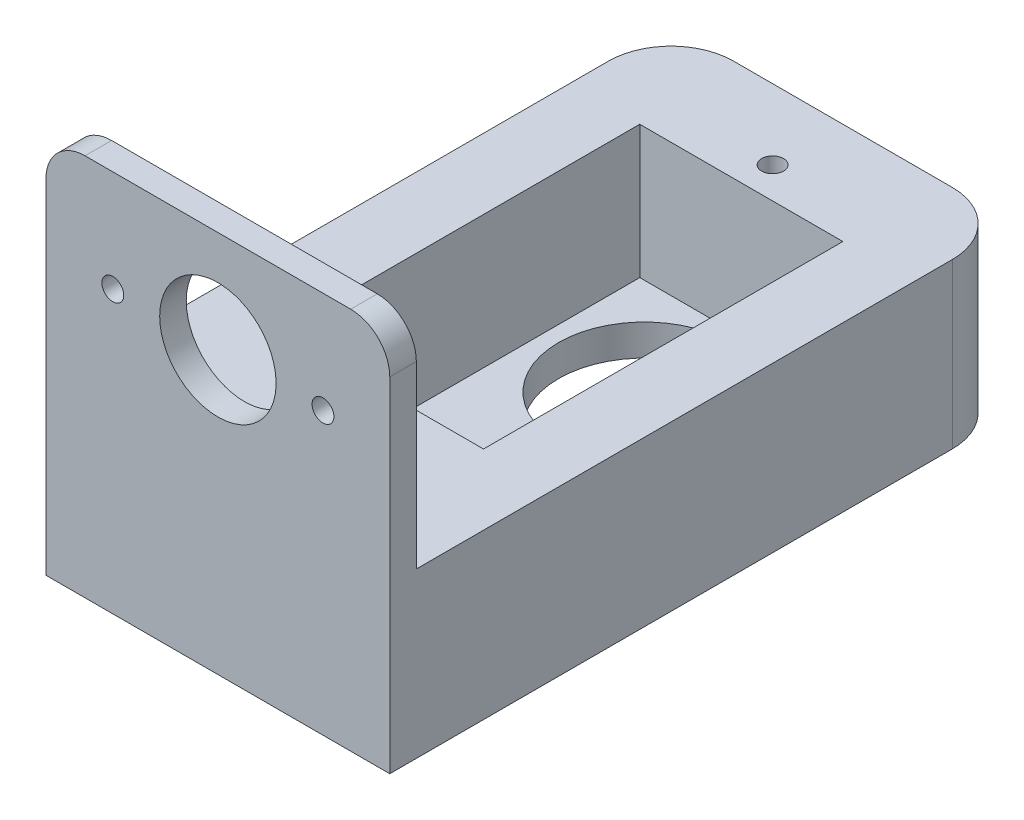
ISO-10303-21;
HEADER;
FILE_DESCRIPTION(('STEP AP214'),'2;1');
FILE_NAME('part.step','',(''),(''),'','','');
FILE_SCHEMA(('AUTOMOTIVE_DESIGN { 1 0 10303 214 1 1 1 1 }'));
ENDSEC;
DATA;
#1=APPLICATION_CONTEXT('core data for automotive mechanical design processes');
#2=APPLICATION_PROTOCOL_DEFINITION('international standard','automotive_design',2000,#1);
#3=PRODUCT_CONTEXT('',#1,'mechanical');
#4=PRODUCT('Part','Part','',(#3));
#5=PRODUCT_RELATED_PRODUCT_CATEGORY('part','',(#4));
#6=PRODUCT_DEFINITION_FORMATION('','',#4);
#7=PRODUCT_DEFINITION_CONTEXT('part definition',#1,'design');
#8=PRODUCT_DEFINITION('design','',#6,#7);
#9=PRODUCT_DEFINITION_SHAPE('','',#8);
#10=(LENGTH_UNIT() NAMED_UNIT(*) SI_UNIT(.MILLI.,.METRE.));
#11=(NAMED_UNIT(*) PLANE_ANGLE_UNIT() SI_UNIT($,.RADIAN.));
#12=(NAMED_UNIT(*) SI_UNIT($,.STERADIAN.) SOLID_ANGLE_UNIT());
#13=UNCERTAINTY_MEASURE_WITH_UNIT(LENGTH_MEASURE(1.E-05),#10,'distance_accuracy_value','');
#14=(GEOMETRIC_REPRESENTATION_CONTEXT(3) GLOBAL_UNCERTAINTY_ASSIGNED_CONTEXT((#13)) GLOBAL_UNIT_ASSIGNED_CONTEXT((#10,
#11,#12)) REPRESENTATION_CONTEXT('',''));
#15=CARTESIAN_POINT('',(0.,0.,0.));
#16=DIRECTION('',(0.,0.,1.));
#17=DIRECTION('',(1.,0.,0.));
#18=AXIS2_PLACEMENT_3D('',#15,#16,#17);
#19=CARTESIAN_POINT('',(0.,10.5,0.));
#20=DIRECTION('',(0.,0.,-1.));
#21=DIRECTION('',(-1.,0.,0.));
#22=AXIS2_PLACEMENT_3D('',#19,#20,#21);
#23=PLANE('',#22);
#24=CARTESIAN_POINT('',(4.275,18.,0.));
#25=DIRECTION('',(0.,0.,-1.));
#26=DIRECTION('',(-1.,0.,0.));
#27=AXIS2_PLACEMENT_3D('',#24,#25,#26);
#28=CIRCLE('',#27,0.7);
#29=CARTESIAN_POINT('',(3.575,18.,0.));
#30=VERTEX_POINT('',#29);
#31=EDGE_CURVE('E392',#30,#30,#28,.T.);
#32=ORIENTED_EDGE('',*,*,#31,.T.);
#33=EDGE_LOOP('',(#32));
#34=FACE_BOUND('',#33,.T.);
#35=CARTESIAN_POINT('',(17.725,18.,0.));
#36=DIRECTION('',(0.,0.,-1.));
#37=DIRECTION('',(-1.,0.,0.));
#38=AXIS2_PLACEMENT_3D('',#35,#36,#37);
#39=CIRCLE('',#38,0.699999999999998);
#40=CARTESIAN_POINT('',(17.025,18.,0.));
#41=VERTEX_POINT('',#40);
#42=EDGE_CURVE('E387',#41,#41,#39,.T.);
#43=ORIENTED_EDGE('',*,*,#42,.T.);
#44=EDGE_LOOP('',(#43));
#45=FACE_BOUND('',#44,.T.);
#46=CARTESIAN_POINT('',(11.,18.,0.));
#47=DIRECTION('',(0.,0.,-1.));
#48=DIRECTION('',(-1.,0.,0.));
#49=AXIS2_PLACEMENT_3D('',#46,#47,#48);
#50=CIRCLE('',#49,3.725);
#51=CARTESIAN_POINT('',(7.275,18.,0.));
#52=VERTEX_POINT('',#51);
#53=EDGE_CURVE('E158',#52,#52,#50,.T.);
#54=ORIENTED_EDGE('',*,*,#53,.T.);
#55=EDGE_LOOP('',(#54));
#56=FACE_BOUND('',#55,.T.);
#57=DIRECTION('',(1.,0.,0.));
#58=VECTOR('',#57,1.);
#59=CARTESIAN_POINT('',(0.,24.5,0.));
#60=LINE('',#59,#58);
#61=CARTESIAN_POINT('',(2.5,24.5,0.));
#62=VERTEX_POINT('',#61);
#63=CARTESIAN_POINT('',(19.5,24.5,0.));
#64=VERTEX_POINT('',#63);
#65=EDGE_CURVE('E157',#62,#64,#60,.T.);
#66=ORIENTED_EDGE('',*,*,#65,.F.);
#67=CARTESIAN_POINT('',(2.5,22.,0.));
#68=DIRECTION('',(0.,0.,-1.));
#69=DIRECTION('',(-1.,0.,0.));
#70=AXIS2_PLACEMENT_3D('',#67,#68,#69);
#71=CIRCLE('',#70,2.5);
#72=CARTESIAN_POINT('',(0.,22.,0.));
#73=VERTEX_POINT('',#72);
#74=EDGE_CURVE('E249',#62,#73,#71,.F.);
#75=ORIENTED_EDGE('',*,*,#74,.T.);
#76=DIRECTION('',(0.,-1.,0.));
#77=VECTOR('',#76,1.);
#78=CARTESIAN_POINT('',(0.,10.5,0.));
#79=LINE('',#78,#77);
#80=CARTESIAN_POINT('',(0.,0.,0.));
#81=VERTEX_POINT('',#80);
#82=EDGE_CURVE('E153',#73,#81,#79,.T.);
#83=ORIENTED_EDGE('',*,*,#82,.T.);
#84=DIRECTION('',(1.,0.,0.));
#85=VECTOR('',#84,1.);
#86=CARTESIAN_POINT('',(0.,0.,0.));
#87=LINE('',#86,#85);
#88=CARTESIAN_POINT('',(22.,0.,0.));
#89=VERTEX_POINT('',#88);
#90=EDGE_CURVE('E200',#81,#89,#87,.T.);
#91=ORIENTED_EDGE('',*,*,#90,.T.);
#92=DIRECTION('',(0.,-1.,0.));
#93=VECTOR('',#92,1.);
#94=CARTESIAN_POINT('',(22.,10.5,0.));
#95=LINE('',#94,#93);
#96=CARTESIAN_POINT('',(22.,22.,0.));
#97=VERTEX_POINT('',#96);
#98=EDGE_CURVE('E223',#97,#89,#95,.T.);
#99=ORIENTED_EDGE('',*,*,#98,.F.);
#100=CARTESIAN_POINT('',(19.5,22.,0.));
#101=DIRECTION('',(0.,0.,-1.));
#102=DIRECTION('',(-1.,0.,0.));
#103=AXIS2_PLACEMENT_3D('',#100,#101,#102);
#104=CIRCLE('',#103,2.5);
#105=EDGE_CURVE('E247',#97,#64,#104,.F.);
#106=ORIENTED_EDGE('',*,*,#105,.T.);
#107=EDGE_LOOP('',(#66,#75,#83,#91,#99,#106));
#108=FACE_BOUND('',#107,.T.);
#109=ADVANCED_FACE('F33',(#34,#45,#56,#108),#23,.F.);
#110=CARTESIAN_POINT('',(22.,10.5,0.));
#111=DIRECTION('',(-1.,0.,0.));
#112=DIRECTION('',(0.,0.,1.));
#113=AXIS2_PLACEMENT_3D('',#110,#111,#112);
#114=PLANE('',#113);
#115=DIRECTION('',(0.,-1.,0.));
#116=VECTOR('',#115,1.);
#117=CARTESIAN_POINT('',(22.,24.5,-1.7));
#118=LINE('',#117,#116);
#119=CARTESIAN_POINT('',(22.,22.,-1.7));
#120=VERTEX_POINT('',#119);
#121=CARTESIAN_POINT('',(22.,10.5,-1.7));
#122=VERTEX_POINT('',#121);
#123=EDGE_CURVE('E140',#120,#122,#118,.T.);
#124=ORIENTED_EDGE('',*,*,#123,.F.);
#125=DIRECTION('',(0.,0.,-1.));
#126=VECTOR('',#125,1.);
#127=CARTESIAN_POINT('',(22.,22.,0.));
#128=LINE('',#127,#126);
#129=EDGE_CURVE('E11',#120,#97,#128,.F.);
#130=ORIENTED_EDGE('',*,*,#129,.T.);
#131=ORIENTED_EDGE('',*,*,#98,.T.);
#132=DIRECTION('',(0.,0.,-1.));
#133=VECTOR('',#132,1.);
#134=CARTESIAN_POINT('',(22.,0.,0.));
#135=LINE('',#134,#133);
#136=CARTESIAN_POINT('',(22.,0.,-36.));
#137=VERTEX_POINT('',#136);
#138=EDGE_CURVE('E214',#89,#137,#135,.T.);
#139=ORIENTED_EDGE('',*,*,#138,.T.);
#140=DIRECTION('',(0.,-1.,0.));
#141=VECTOR('',#140,1.);
#142=CARTESIAN_POINT('',(22.,10.5,-36.));
#143=LINE('',#142,#141);
#144=CARTESIAN_POINT('',(22.,10.5,-36.));
#145=VERTEX_POINT('',#144);
#146=EDGE_CURVE('E239',#137,#145,#143,.F.);
#147=ORIENTED_EDGE('',*,*,#146,.T.);
#148=DIRECTION('',(0.,0.,-1.));
#149=VECTOR('',#148,1.);
#150=CARTESIAN_POINT('',(22.,10.5,0.));
#151=LINE('',#150,#149);
#152=EDGE_CURVE('E207',#122,#145,#151,.T.);
#153=ORIENTED_EDGE('',*,*,#152,.F.);
#154=EDGE_LOOP('',(#124,#130,#131,#139,#147,#153));
#155=FACE_BOUND('',#154,.T.);
#156=ADVANCED_FACE('F272',(#155),#114,.F.);
#157=CARTESIAN_POINT('',(0.,10.5,-40.));
#158=DIRECTION('',(0.,0.,-1.));
#159=DIRECTION('',(-1.,0.,0.));
#160=AXIS2_PLACEMENT_3D('',#157,#158,#159);
#161=PLANE('',#160);
#162=DIRECTION('',(1.,0.,0.));
#163=VECTOR('',#162,1.);
#164=CARTESIAN_POINT('',(0.,0.,-40.));
#165=LINE('',#164,#163);
#166=CARTESIAN_POINT('',(3.99999999999999,0.,-40.));
#167=VERTEX_POINT('',#166);
#168=CARTESIAN_POINT('',(18.,0.,-40.));
#169=VERTEX_POINT('',#168);
#170=EDGE_CURVE('E217',#167,#169,#165,.T.);
#171=ORIENTED_EDGE('',*,*,#170,.F.);
#172=DIRECTION('',(0.,-1.,0.));
#173=VECTOR('',#172,1.);
#174=CARTESIAN_POINT('',(3.99999999999999,10.5,-40.));
#175=LINE('',#174,#173);
#176=CARTESIAN_POINT('',(3.99999999999999,10.5,-40.));
#177=VERTEX_POINT('',#176);
#178=EDGE_CURVE('E234',#167,#177,#175,.F.);
#179=ORIENTED_EDGE('',*,*,#178,.T.);
#180=DIRECTION('',(1.,0.,0.));
#181=VECTOR('',#180,1.);
#182=CARTESIAN_POINT('',(0.,10.5,-40.));
#183=LINE('',#182,#181);
#184=CARTESIAN_POINT('',(18.,10.5,-40.));
#185=VERTEX_POINT('',#184);
#186=EDGE_CURVE('E154',#177,#185,#183,.T.);
#187=ORIENTED_EDGE('',*,*,#186,.T.);
#188=DIRECTION('',(0.,-1.,0.));
#189=VECTOR('',#188,1.);
#190=CARTESIAN_POINT('',(18.,0.,-40.));
#191=LINE('',#190,#189);
#192=EDGE_CURVE('E231',#185,#169,#191,.T.);
#193=ORIENTED_EDGE('',*,*,#192,.T.);
#194=EDGE_LOOP('',(#171,#179,#187,#193));
#195=FACE_BOUND('',#194,.T.);
#196=ADVANCED_FACE('F279',(#195),#161,.T.);
#197=CARTESIAN_POINT('',(0.,10.5,0.));
#198=DIRECTION('',(-1.,0.,0.));
#199=DIRECTION('',(0.,0.,1.));
#200=AXIS2_PLACEMENT_3D('',#197,#198,#199);
#201=PLANE('',#200);
#202=ORIENTED_EDGE('',*,*,#82,.F.);
#203=DIRECTION('',(0.,0.,1.));
#204=VECTOR('',#203,1.);
#205=CARTESIAN_POINT('',(0.,22.,0.));
#206=LINE('',#205,#204);
#207=CARTESIAN_POINT('',(0.,22.,-1.7));
#208=VERTEX_POINT('',#207);
#209=EDGE_CURVE('E56',#73,#208,#206,.F.);
#210=ORIENTED_EDGE('',*,*,#209,.T.);
#211=DIRECTION('',(0.,-1.,0.));
#212=VECTOR('',#211,1.);
#213=CARTESIAN_POINT('',(0.,24.5,-1.7));
#214=LINE('',#213,#212);
#215=CARTESIAN_POINT('',(0.,10.5,-1.7));
#216=VERTEX_POINT('',#215);
#217=EDGE_CURVE('E132',#208,#216,#214,.T.);
#218=ORIENTED_EDGE('',*,*,#217,.T.);
#219=DIRECTION('',(0.,0.,-1.));
#220=VECTOR('',#219,1.);
#221=CARTESIAN_POINT('',(0.,10.5,0.));
#222=LINE('',#221,#220);
#223=CARTESIAN_POINT('',(0.,10.5,-36.));
#224=VERTEX_POINT('',#223);
#225=EDGE_CURVE('E136',#216,#224,#222,.T.);
#226=ORIENTED_EDGE('',*,*,#225,.T.);
#227=DIRECTION('',(0.,-1.,0.));
#228=VECTOR('',#227,1.);
#229=CARTESIAN_POINT('',(0.,10.5,-36.));
#230=LINE('',#229,#228);
#231=CARTESIAN_POINT('',(0.,0.,-36.));
#232=VERTEX_POINT('',#231);
#233=EDGE_CURVE('E225',#224,#232,#230,.T.);
#234=ORIENTED_EDGE('',*,*,#233,.T.);
#235=DIRECTION('',(0.,0.,-1.));
#236=VECTOR('',#235,1.);
#237=CARTESIAN_POINT('',(0.,0.,0.));
#238=LINE('',#237,#236);
#239=EDGE_CURVE('E209',#81,#232,#238,.T.);
#240=ORIENTED_EDGE('',*,*,#239,.F.);
#241=EDGE_LOOP('',(#202,#210,#218,#226,#234,#240));
#242=FACE_BOUND('',#241,.T.);
#243=ADVANCED_FACE('F134',(#242),#201,.T.);
#244=CARTESIAN_POINT('',(0.,10.5,0.));
#245=DIRECTION('',(0.,1.,0.));
#246=DIRECTION('',(0.,0.,1.));
#247=AXIS2_PLACEMENT_3D('',#244,#245,#246);
#248=PLANE('',#247);
#249=CARTESIAN_POINT('',(11.,10.5,-35.5));
#250=DIRECTION('',(0.,1.,0.));
#251=DIRECTION('',(0.,0.,1.));
#252=AXIS2_PLACEMENT_3D('',#249,#250,#251);
#253=CIRCLE('',#252,0.699999999999999);
#254=CARTESIAN_POINT('',(11.,10.5,-34.8));
#255=VERTEX_POINT('',#254);
#256=EDGE_CURVE('E373',#255,#255,#253,.T.);
#257=ORIENTED_EDGE('',*,*,#256,.F.);
#258=EDGE_LOOP('',(#257));
#259=FACE_BOUND('',#258,.T.);
#260=CARTESIAN_POINT('',(11.,10.5,-7.5));
#261=DIRECTION('',(0.,1.,0.));
#262=DIRECTION('',(0.,0.,1.));
#263=AXIS2_PLACEMENT_3D('',#260,#261,#262);
#264=CIRCLE('',#263,0.7);
#265=CARTESIAN_POINT('',(11.,10.5,-6.8));
#266=VERTEX_POINT('',#265);
#267=EDGE_CURVE('E379',#266,#266,#264,.T.);
#268=ORIENTED_EDGE('',*,*,#267,.F.);
#269=EDGE_LOOP('',(#268));
#270=FACE_BOUND('',#269,.T.);
#271=ORIENTED_EDGE('',*,*,#186,.F.);
#272=CARTESIAN_POINT('',(3.99999999999999,10.5,-36.));
#273=DIRECTION('',(0.,1.,0.));
#274=DIRECTION('',(0.,0.,1.));
#275=AXIS2_PLACEMENT_3D('',#272,#273,#274);
#276=CIRCLE('',#275,4.);
#277=EDGE_CURVE('E152',#177,#224,#276,.T.);
#278=ORIENTED_EDGE('',*,*,#277,.T.);
#279=ORIENTED_EDGE('',*,*,#225,.F.);
#280=DIRECTION('',(-1.,0.,0.));
#281=VECTOR('',#280,1.);
#282=CARTESIAN_POINT('',(0.,10.5,-1.7));
#283=LINE('',#282,#281);
#284=EDGE_CURVE('E149',#122,#216,#283,.T.);
#285=ORIENTED_EDGE('',*,*,#284,.F.);
#286=ORIENTED_EDGE('',*,*,#152,.T.);
#287=CARTESIAN_POINT('',(18.,10.5,-36.));
#288=DIRECTION('',(0.,1.,0.));
#289=DIRECTION('',(0.,0.,1.));
#290=AXIS2_PLACEMENT_3D('',#287,#288,#289);
#291=CIRCLE('',#290,4.);
#292=EDGE_CURVE('E236',#145,#185,#291,.T.);
#293=ORIENTED_EDGE('',*,*,#292,.T.);
#294=EDGE_LOOP('',(#271,#278,#279,#285,#286,#293));
#295=FACE_BOUND('',#294,.T.);
#296=DIRECTION('',(0.,0.,1.));
#297=VECTOR('',#296,1.);
#298=CARTESIAN_POINT('',(4.5,10.5,-33.5));
#299=LINE('',#298,#297);
#300=CARTESIAN_POINT('',(4.5,10.5,-33.5));
#301=VERTEX_POINT('',#300);
#302=CARTESIAN_POINT('',(4.5,10.5,-10.5));
#303=VERTEX_POINT('',#302);
#304=EDGE_CURVE('E172',#301,#303,#299,.T.);
#305=ORIENTED_EDGE('',*,*,#304,.F.);
#306=DIRECTION('',(-1.,0.,0.));
#307=VECTOR('',#306,1.);
#308=CARTESIAN_POINT('',(4.5,10.5,-33.5));
#309=LINE('',#308,#307);
#310=CARTESIAN_POINT('',(17.5,10.5,-33.5));
#311=VERTEX_POINT('',#310);
#312=EDGE_CURVE('E179',#311,#301,#309,.T.);
#313=ORIENTED_EDGE('',*,*,#312,.F.);
#314=DIRECTION('',(0.,0.,-1.));
#315=VECTOR('',#314,1.);
#316=CARTESIAN_POINT('',(17.5,10.5,-33.5));
#317=LINE('',#316,#315);
#318=CARTESIAN_POINT('',(17.5,10.5,-10.5));
#319=VERTEX_POINT('',#318);
#320=EDGE_CURVE('E193',#319,#311,#317,.T.);
#321=ORIENTED_EDGE('',*,*,#320,.F.);
#322=DIRECTION('',(1.,0.,0.));
#323=VECTOR('',#322,1.);
#324=CARTESIAN_POINT('',(4.5,10.5,-10.5));
#325=LINE('',#324,#323);
#326=EDGE_CURVE('E190',#303,#319,#325,.T.);
#327=ORIENTED_EDGE('',*,*,#326,.F.);
#328=EDGE_LOOP('',(#305,#313,#321,#327));
#329=FACE_BOUND('',#328,.T.);
#330=ADVANCED_FACE('F146',(#259,#270,#295,#329),#248,.T.);
#331=CARTESIAN_POINT('',(0.,0.,0.));
#332=DIRECTION('',(0.,1.,0.));
#333=DIRECTION('',(0.,0.,1.));
#334=AXIS2_PLACEMENT_3D('',#331,#332,#333);
#335=PLANE('',#334);
#336=CARTESIAN_POINT('',(11.,0.,-27.3));
#337=DIRECTION('',(0.,1.,0.));
#338=DIRECTION('',(0.,0.,1.));
#339=AXIS2_PLACEMENT_3D('',#336,#337,#338);
#340=CIRCLE('',#339,5.5);
#341=CARTESIAN_POINT('',(11.,0.,-21.8));
#342=VERTEX_POINT('',#341);
#343=EDGE_CURVE('E169',#342,#342,#340,.T.);
#344=ORIENTED_EDGE('',*,*,#343,.T.);
#345=EDGE_LOOP('',(#344));
#346=FACE_BOUND('',#345,.T.);
#347=ORIENTED_EDGE('',*,*,#239,.T.);
#348=CARTESIAN_POINT('',(3.99999999999999,0.,-36.));
#349=DIRECTION('',(0.,1.,0.));
#350=DIRECTION('',(0.,0.,1.));
#351=AXIS2_PLACEMENT_3D('',#348,#349,#350);
#352=CIRCLE('',#351,4.);
#353=EDGE_CURVE('E229',#232,#167,#352,.F.);
#354=ORIENTED_EDGE('',*,*,#353,.T.);
#355=ORIENTED_EDGE('',*,*,#170,.T.);
#356=CARTESIAN_POINT('',(18.,0.,-36.));
#357=DIRECTION('',(0.,1.,0.));
#358=DIRECTION('',(0.,0.,1.));
#359=AXIS2_PLACEMENT_3D('',#356,#357,#358);
#360=CIRCLE('',#359,4.);
#361=EDGE_CURVE('E227',#169,#137,#360,.F.);
#362=ORIENTED_EDGE('',*,*,#361,.T.);
#363=ORIENTED_EDGE('',*,*,#138,.F.);
#364=ORIENTED_EDGE('',*,*,#90,.F.);
#365=EDGE_LOOP('',(#347,#354,#355,#362,#363,#364));
#366=FACE_BOUND('',#365,.T.);
#367=ADVANCED_FACE('F264',(#346,#366),#335,.F.);
#368=CARTESIAN_POINT('',(4.5,2.,-33.5));
#369=DIRECTION('',(-1.,0.,0.));
#370=DIRECTION('',(0.,0.,1.));
#371=AXIS2_PLACEMENT_3D('',#368,#369,#370);
#372=PLANE('',#371);
#373=ORIENTED_EDGE('',*,*,#304,.T.);
#374=DIRECTION('',(0.,1.,0.));
#375=VECTOR('',#374,1.);
#376=CARTESIAN_POINT('',(4.5,2.,-10.5));
#377=LINE('',#376,#375);
#378=CARTESIAN_POINT('',(4.5,2.,-10.5));
#379=VERTEX_POINT('',#378);
#380=EDGE_CURVE('E188',#379,#303,#377,.T.);
#381=ORIENTED_EDGE('',*,*,#380,.F.);
#382=DIRECTION('',(0.,0.,1.));
#383=VECTOR('',#382,1.);
#384=CARTESIAN_POINT('',(4.5,2.,-33.5));
#385=LINE('',#384,#383);
#386=CARTESIAN_POINT('',(4.5,2.,-33.5));
#387=VERTEX_POINT('',#386);
#388=EDGE_CURVE('E175',#387,#379,#385,.T.);
#389=ORIENTED_EDGE('',*,*,#388,.F.);
#390=DIRECTION('',(0.,1.,0.));
#391=VECTOR('',#390,1.);
#392=CARTESIAN_POINT('',(4.5,2.,-33.5));
#393=LINE('',#392,#391);
#394=EDGE_CURVE('E198',#387,#301,#393,.T.);
#395=ORIENTED_EDGE('',*,*,#394,.T.);
#396=EDGE_LOOP('',(#373,#381,#389,#395));
#397=FACE_BOUND('',#396,.T.);
#398=ADVANCED_FACE('F310',(#397),#372,.F.);
#399=CARTESIAN_POINT('',(4.5,2.,-33.5));
#400=DIRECTION('',(0.,0.,-1.));
#401=DIRECTION('',(-1.,0.,0.));
#402=AXIS2_PLACEMENT_3D('',#399,#400,#401);
#403=PLANE('',#402);
#404=ORIENTED_EDGE('',*,*,#312,.T.);
#405=ORIENTED_EDGE('',*,*,#394,.F.);
#406=DIRECTION('',(-1.,0.,0.));
#407=VECTOR('',#406,1.);
#408=CARTESIAN_POINT('',(4.5,2.,-33.5));
#409=LINE('',#408,#407);
#410=CARTESIAN_POINT('',(17.5,2.,-33.5));
#411=VERTEX_POINT('',#410);
#412=EDGE_CURVE('E185',#411,#387,#409,.T.);
#413=ORIENTED_EDGE('',*,*,#412,.F.);
#414=DIRECTION('',(0.,1.,0.));
#415=VECTOR('',#414,1.);
#416=CARTESIAN_POINT('',(17.5,2.,-33.5));
#417=LINE('',#416,#415);
#418=EDGE_CURVE('E201',#411,#311,#417,.T.);
#419=ORIENTED_EDGE('',*,*,#418,.T.);
#420=EDGE_LOOP('',(#404,#405,#413,#419));
#421=FACE_BOUND('',#420,.T.);
#422=ADVANCED_FACE('F317',(#421),#403,.F.);
#423=CARTESIAN_POINT('',(17.5,2.,-33.5));
#424=DIRECTION('',(1.,0.,0.));
#425=DIRECTION('',(0.,0.,-1.));
#426=AXIS2_PLACEMENT_3D('',#423,#424,#425);
#427=PLANE('',#426);
#428=ORIENTED_EDGE('',*,*,#320,.T.);
#429=ORIENTED_EDGE('',*,*,#418,.F.);
#430=DIRECTION('',(0.,0.,-1.));
#431=VECTOR('',#430,1.);
#432=CARTESIAN_POINT('',(17.5,2.,-33.5));
#433=LINE('',#432,#431);
#434=CARTESIAN_POINT('',(17.5,2.,-10.5));
#435=VERTEX_POINT('',#434);
#436=EDGE_CURVE('E182',#435,#411,#433,.T.);
#437=ORIENTED_EDGE('',*,*,#436,.F.);
#438=DIRECTION('',(0.,1.,0.));
#439=VECTOR('',#438,1.);
#440=CARTESIAN_POINT('',(17.5,2.,-10.5));
#441=LINE('',#440,#439);
#442=EDGE_CURVE('E203',#435,#319,#441,.T.);
#443=ORIENTED_EDGE('',*,*,#442,.T.);
#444=EDGE_LOOP('',(#428,#429,#437,#443));
#445=FACE_BOUND('',#444,.T.);
#446=ADVANCED_FACE('F323',(#445),#427,.F.);
#447=CARTESIAN_POINT('',(4.5,2.,-10.5));
#448=DIRECTION('',(0.,0.,1.));
#449=DIRECTION('',(1.,0.,0.));
#450=AXIS2_PLACEMENT_3D('',#447,#448,#449);
#451=PLANE('',#450);
#452=ORIENTED_EDGE('',*,*,#326,.T.);
#453=ORIENTED_EDGE('',*,*,#442,.F.);
#454=DIRECTION('',(1.,0.,0.));
#455=VECTOR('',#454,1.);
#456=CARTESIAN_POINT('',(4.5,2.,-10.5));
#457=LINE('',#456,#455);
#458=EDGE_CURVE('E178',#379,#435,#457,.T.);
#459=ORIENTED_EDGE('',*,*,#458,.F.);
#460=ORIENTED_EDGE('',*,*,#380,.T.);
#461=EDGE_LOOP('',(#452,#453,#459,#460));
#462=FACE_BOUND('',#461,.T.);
#463=ADVANCED_FACE('F319',(#462),#451,.F.);
#464=CARTESIAN_POINT('',(0.,2.,0.));
#465=DIRECTION('',(0.,1.,0.));
#466=DIRECTION('',(0.,0.,1.));
#467=AXIS2_PLACEMENT_3D('',#464,#465,#466);
#468=PLANE('',#467);
#469=CARTESIAN_POINT('',(11.,2.,-27.3));
#470=DIRECTION('',(0.,1.,0.));
#471=DIRECTION('',(0.,0.,1.));
#472=AXIS2_PLACEMENT_3D('',#469,#470,#471);
#473=CIRCLE('',#472,5.5);
#474=CARTESIAN_POINT('',(11.,2.,-21.8));
#475=VERTEX_POINT('',#474);
#476=EDGE_CURVE('E168',#475,#475,#473,.T.);
#477=ORIENTED_EDGE('',*,*,#476,.F.);
#478=EDGE_LOOP('',(#477));
#479=FACE_BOUND('',#478,.T.);
#480=ORIENTED_EDGE('',*,*,#388,.T.);
#481=ORIENTED_EDGE('',*,*,#458,.T.);
#482=ORIENTED_EDGE('',*,*,#436,.T.);
#483=ORIENTED_EDGE('',*,*,#412,.T.);
#484=EDGE_LOOP('',(#480,#481,#482,#483));
#485=FACE_BOUND('',#484,.T.);
#486=ADVANCED_FACE('F322',(#479,#485),#468,.T.);
#487=CARTESIAN_POINT('',(11.,0.,-27.3));
#488=DIRECTION('',(0.,1.,0.));
#489=DIRECTION('',(0.,0.,1.));
#490=AXIS2_PLACEMENT_3D('',#487,#488,#489);
#491=CYLINDRICAL_SURFACE('',#490,5.5);
#492=ORIENTED_EDGE('',*,*,#343,.F.);
#493=EDGE_LOOP('',(#492));
#494=FACE_BOUND('',#493,.T.);
#495=ORIENTED_EDGE('',*,*,#476,.T.);
#496=EDGE_LOOP('',(#495));
#497=FACE_BOUND('',#496,.T.);
#498=ADVANCED_FACE('F333',(#494,#497),#491,.F.);
#499=CARTESIAN_POINT('',(0.,24.5,-1.7));
#500=DIRECTION('',(0.,0.,1.));
#501=DIRECTION('',(1.,0.,0.));
#502=AXIS2_PLACEMENT_3D('',#499,#500,#501);
#503=PLANE('',#502);
#504=CARTESIAN_POINT('',(4.275,18.,-1.7));
#505=DIRECTION('',(0.,0.,-1.));
#506=DIRECTION('',(-1.,0.,0.));
#507=AXIS2_PLACEMENT_3D('',#504,#505,#506);
#508=CIRCLE('',#507,0.7);
#509=CARTESIAN_POINT('',(3.575,18.,-1.7));
#510=VERTEX_POINT('',#509);
#511=EDGE_CURVE('E376',#510,#510,#508,.T.);
#512=ORIENTED_EDGE('',*,*,#511,.F.);
#513=EDGE_LOOP('',(#512));
#514=FACE_BOUND('',#513,.T.);
#515=CARTESIAN_POINT('',(17.725,18.,-1.7));
#516=DIRECTION('',(0.,0.,-1.));
#517=DIRECTION('',(-1.,0.,0.));
#518=AXIS2_PLACEMENT_3D('',#515,#516,#517);
#519=CIRCLE('',#518,0.699999999999998);
#520=CARTESIAN_POINT('',(17.025,18.,-1.7));
#521=VERTEX_POINT('',#520);
#522=EDGE_CURVE('E384',#521,#521,#519,.T.);
#523=ORIENTED_EDGE('',*,*,#522,.F.);
#524=EDGE_LOOP('',(#523));
#525=FACE_BOUND('',#524,.T.);
#526=CARTESIAN_POINT('',(11.,18.,-1.7));
#527=DIRECTION('',(0.,0.,-1.));
#528=DIRECTION('',(-1.,0.,0.));
#529=AXIS2_PLACEMENT_3D('',#526,#527,#528);
#530=CIRCLE('',#529,3.725);
#531=CARTESIAN_POINT('',(7.275,18.,-1.7));
#532=VERTEX_POINT('',#531);
#533=EDGE_CURVE('E163',#532,#532,#530,.T.);
#534=ORIENTED_EDGE('',*,*,#533,.F.);
#535=EDGE_LOOP('',(#534));
#536=FACE_BOUND('',#535,.T.);
#537=ORIENTED_EDGE('',*,*,#217,.F.);
#538=CARTESIAN_POINT('',(2.5,22.,-1.7));
#539=DIRECTION('',(0.,0.,1.));
#540=DIRECTION('',(1.,0.,0.));
#541=AXIS2_PLACEMENT_3D('',#538,#539,#540);
#542=CIRCLE('',#541,2.5);
#543=CARTESIAN_POINT('',(2.5,24.5,-1.7));
#544=VERTEX_POINT('',#543);
#545=EDGE_CURVE('E41',#208,#544,#542,.F.);
#546=ORIENTED_EDGE('',*,*,#545,.T.);
#547=DIRECTION('',(-1.,0.,0.));
#548=VECTOR('',#547,1.);
#549=CARTESIAN_POINT('',(0.,24.5,-1.7));
#550=LINE('',#549,#548);
#551=CARTESIAN_POINT('',(19.5,24.5,-1.7));
#552=VERTEX_POINT('',#551);
#553=EDGE_CURVE('E141',#552,#544,#550,.T.);
#554=ORIENTED_EDGE('',*,*,#553,.F.);
#555=CARTESIAN_POINT('',(19.5,22.,-1.7));
#556=DIRECTION('',(0.,0.,1.));
#557=DIRECTION('',(1.,0.,0.));
#558=AXIS2_PLACEMENT_3D('',#555,#556,#557);
#559=CIRCLE('',#558,2.5);
#560=EDGE_CURVE('E48',#552,#120,#559,.F.);
#561=ORIENTED_EDGE('',*,*,#560,.T.);
#562=ORIENTED_EDGE('',*,*,#123,.T.);
#563=ORIENTED_EDGE('',*,*,#284,.T.);
#564=EDGE_LOOP('',(#537,#546,#554,#561,#562,#563));
#565=FACE_BOUND('',#564,.T.);
#566=ADVANCED_FACE('F156',(#514,#525,#536,#565),#503,.F.);
#567=CARTESIAN_POINT('',(0.,24.5,0.));
#568=DIRECTION('',(0.,1.,0.));
#569=DIRECTION('',(0.,0.,1.));
#570=AXIS2_PLACEMENT_3D('',#567,#568,#569);
#571=PLANE('',#570);
#572=ORIENTED_EDGE('',*,*,#553,.T.);
#573=DIRECTION('',(0.,0.,1.));
#574=VECTOR('',#573,1.);
#575=CARTESIAN_POINT('',(2.5,24.5,0.));
#576=LINE('',#575,#574);
#577=EDGE_CURVE('E244',#544,#62,#576,.T.);
#578=ORIENTED_EDGE('',*,*,#577,.T.);
#579=ORIENTED_EDGE('',*,*,#65,.T.);
#580=DIRECTION('',(0.,0.,-1.));
#581=VECTOR('',#580,1.);
#582=CARTESIAN_POINT('',(19.5,24.5,-1.7));
#583=LINE('',#582,#581);
#584=EDGE_CURVE('E241',#64,#552,#583,.T.);
#585=ORIENTED_EDGE('',*,*,#584,.T.);
#586=EDGE_LOOP('',(#572,#578,#579,#585));
#587=FACE_BOUND('',#586,.T.);
#588=ADVANCED_FACE('F256',(#587),#571,.T.);
#589=CARTESIAN_POINT('',(11.,18.,0.));
#590=DIRECTION('',(0.,0.,-1.));
#591=DIRECTION('',(-1.,0.,0.));
#592=AXIS2_PLACEMENT_3D('',#589,#590,#591);
#593=CYLINDRICAL_SURFACE('',#592,3.725);
#594=ORIENTED_EDGE('',*,*,#53,.F.);
#595=EDGE_LOOP('',(#594));
#596=FACE_BOUND('',#595,.T.);
#597=ORIENTED_EDGE('',*,*,#533,.T.);
#598=EDGE_LOOP('',(#597));
#599=FACE_BOUND('',#598,.T.);
#600=ADVANCED_FACE('F343',(#596,#599),#593,.F.);
#601=CARTESIAN_POINT('',(17.725,18.,8.3));
#602=DIRECTION('',(0.,0.,-1.));
#603=DIRECTION('',(-1.,0.,0.));
#604=AXIS2_PLACEMENT_3D('',#601,#602,#603);
#605=CYLINDRICAL_SURFACE('',#604,0.699999999999998);
#606=ORIENTED_EDGE('',*,*,#522,.T.);
#607=EDGE_LOOP('',(#606));
#608=FACE_BOUND('',#607,.T.);
#609=ORIENTED_EDGE('',*,*,#42,.F.);
#610=EDGE_LOOP('',(#609));
#611=FACE_BOUND('',#610,.T.);
#612=ADVANCED_FACE('F346',(#608,#611),#605,.F.);
#613=CARTESIAN_POINT('',(4.275,18.,8.3));
#614=DIRECTION('',(0.,0.,-1.));
#615=DIRECTION('',(-1.,0.,0.));
#616=AXIS2_PLACEMENT_3D('',#613,#614,#615);
#617=CYLINDRICAL_SURFACE('',#616,0.7);
#618=ORIENTED_EDGE('',*,*,#511,.T.);
#619=EDGE_LOOP('',(#618));
#620=FACE_BOUND('',#619,.T.);
#621=ORIENTED_EDGE('',*,*,#31,.F.);
#622=EDGE_LOOP('',(#621));
#623=FACE_BOUND('',#622,.T.);
#624=ADVANCED_FACE('F348',(#620,#623),#617,.F.);
#625=CARTESIAN_POINT('',(11.,8.,-7.5));
#626=DIRECTION('',(0.,1.,0.));
#627=DIRECTION('',(0.,0.,1.));
#628=AXIS2_PLACEMENT_3D('',#625,#626,#627);
#629=CYLINDRICAL_SURFACE('',#628,0.7);
#630=CARTESIAN_POINT('',(11.,8.,-7.5));
#631=DIRECTION('',(0.,1.,0.));
#632=DIRECTION('',(0.,0.,1.));
#633=AXIS2_PLACEMENT_3D('',#630,#631,#632);
#634=CIRCLE('',#633,0.7);
#635=CARTESIAN_POINT('',(11.,8.,-6.8));
#636=VERTEX_POINT('',#635);
#637=EDGE_CURVE('E374',#636,#636,#634,.T.);
#638=ORIENTED_EDGE('',*,*,#637,.F.);
#639=EDGE_LOOP('',(#638));
#640=FACE_BOUND('',#639,.T.);
#641=ORIENTED_EDGE('',*,*,#267,.T.);
#642=EDGE_LOOP('',(#641));
#643=FACE_BOUND('',#642,.T.);
#644=ADVANCED_FACE('F351',(#640,#643),#629,.F.);
#645=CARTESIAN_POINT('',(11.,8.,-7.5));
#646=DIRECTION('',(0.,1.,0.));
#647=DIRECTION('',(0.,0.,1.));
#648=AXIS2_PLACEMENT_3D('',#645,#646,#647);
#649=PLANE('',#648);
#650=ORIENTED_EDGE('',*,*,#637,.T.);
#651=EDGE_LOOP('',(#650));
#652=FACE_BOUND('',#651,.T.);
#653=ADVANCED_FACE('F358',(#652),#649,.T.);
#654=CARTESIAN_POINT('',(11.,8.,-35.5));
#655=DIRECTION('',(0.,1.,0.));
#656=DIRECTION('',(0.,0.,1.));
#657=AXIS2_PLACEMENT_3D('',#654,#655,#656);
#658=CYLINDRICAL_SURFACE('',#657,0.699999999999999);
#659=CARTESIAN_POINT('',(11.,8.,-35.5));
#660=DIRECTION('',(0.,1.,0.));
#661=DIRECTION('',(0.,0.,1.));
#662=AXIS2_PLACEMENT_3D('',#659,#660,#661);
#663=CIRCLE('',#662,0.699999999999999);
#664=CARTESIAN_POINT('',(11.,8.,-34.8));
#665=VERTEX_POINT('',#664);
#666=EDGE_CURVE('E370',#665,#665,#663,.T.);
#667=ORIENTED_EDGE('',*,*,#666,.F.);
#668=EDGE_LOOP('',(#667));
#669=FACE_BOUND('',#668,.T.);
#670=ORIENTED_EDGE('',*,*,#256,.T.);
#671=EDGE_LOOP('',(#670));
#672=FACE_BOUND('',#671,.T.);
#673=ADVANCED_FACE('F291',(#669,#672),#658,.F.);
#674=CARTESIAN_POINT('',(11.,8.,-35.5));
#675=DIRECTION('',(0.,1.,0.));
#676=DIRECTION('',(0.,0.,1.));
#677=AXIS2_PLACEMENT_3D('',#674,#675,#676);
#678=PLANE('',#677);
#679=ORIENTED_EDGE('',*,*,#666,.T.);
#680=EDGE_LOOP('',(#679));
#681=FACE_BOUND('',#680,.T.);
#682=ADVANCED_FACE('F284',(#681),#678,.T.);
#683=CARTESIAN_POINT('',(3.99999999999999,10.5,-36.));
#684=DIRECTION('',(0.,-1.,0.));
#685=DIRECTION('',(0.,0.,-1.));
#686=AXIS2_PLACEMENT_3D('',#683,#684,#685);
#687=CYLINDRICAL_SURFACE('',#686,4.);
#688=ORIENTED_EDGE('',*,*,#277,.F.);
#689=ORIENTED_EDGE('',*,*,#178,.F.);
#690=ORIENTED_EDGE('',*,*,#353,.F.);
#691=ORIENTED_EDGE('',*,*,#233,.F.);
#692=EDGE_LOOP('',(#688,#689,#690,#691));
#693=FACE_BOUND('',#692,.T.);
#694=ADVANCED_FACE('F282',(#693),#687,.T.);
#695=CARTESIAN_POINT('',(18.,10.5,-36.));
#696=DIRECTION('',(0.,1.,0.));
#697=DIRECTION('',(0.,0.,1.));
#698=AXIS2_PLACEMENT_3D('',#695,#696,#697);
#699=CYLINDRICAL_SURFACE('',#698,4.);
#700=ORIENTED_EDGE('',*,*,#292,.F.);
#701=ORIENTED_EDGE('',*,*,#146,.F.);
#702=ORIENTED_EDGE('',*,*,#361,.F.);
#703=ORIENTED_EDGE('',*,*,#192,.F.);
#704=EDGE_LOOP('',(#700,#701,#702,#703));
#705=FACE_BOUND('',#704,.T.);
#706=ADVANCED_FACE('F277',(#705),#699,.T.);
#707=CARTESIAN_POINT('',(2.5,22.,0.));
#708=DIRECTION('',(0.,0.,1.));
#709=DIRECTION('',(1.,0.,0.));
#710=AXIS2_PLACEMENT_3D('',#707,#708,#709);
#711=CYLINDRICAL_SURFACE('',#710,2.5);
#712=ORIENTED_EDGE('',*,*,#545,.F.);
#713=ORIENTED_EDGE('',*,*,#209,.F.);
#714=ORIENTED_EDGE('',*,*,#74,.F.);
#715=ORIENTED_EDGE('',*,*,#577,.F.);
#716=EDGE_LOOP('',(#712,#713,#714,#715));
#717=FACE_BOUND('',#716,.T.);
#718=ADVANCED_FACE('F259',(#717),#711,.T.);
#719=CARTESIAN_POINT('',(19.5,22.,0.));
#720=DIRECTION('',(0.,0.,1.));
#721=DIRECTION('',(1.,0.,0.));
#722=AXIS2_PLACEMENT_3D('',#719,#720,#721);
#723=CYLINDRICAL_SURFACE('',#722,2.5);
#724=ORIENTED_EDGE('',*,*,#105,.F.);
#725=ORIENTED_EDGE('',*,*,#129,.F.);
#726=ORIENTED_EDGE('',*,*,#560,.F.);
#727=ORIENTED_EDGE('',*,*,#584,.F.);
#728=EDGE_LOOP('',(#724,#725,#726,#727));
#729=FACE_BOUND('',#728,.T.);
#730=ADVANCED_FACE('F35',(#729),#723,.T.);
#731=CLOSED_SHELL('',(#109,#156,#196,#243,#330,#367,#398,#422,#446,#463,#486,#498,#566,#588,
#600,#612,#624,#644,#653,#673,#682,#694,#706,#718,#730));
#732=MANIFOLD_SOLID_BREP('B2',#731);
#733=ADVANCED_BREP_SHAPE_REPRESENTATION('',(#18,#732),#14);
#734=SHAPE_DEFINITION_REPRESENTATION(#9,#733);
ENDSEC;
END-ISO-10303-21;
